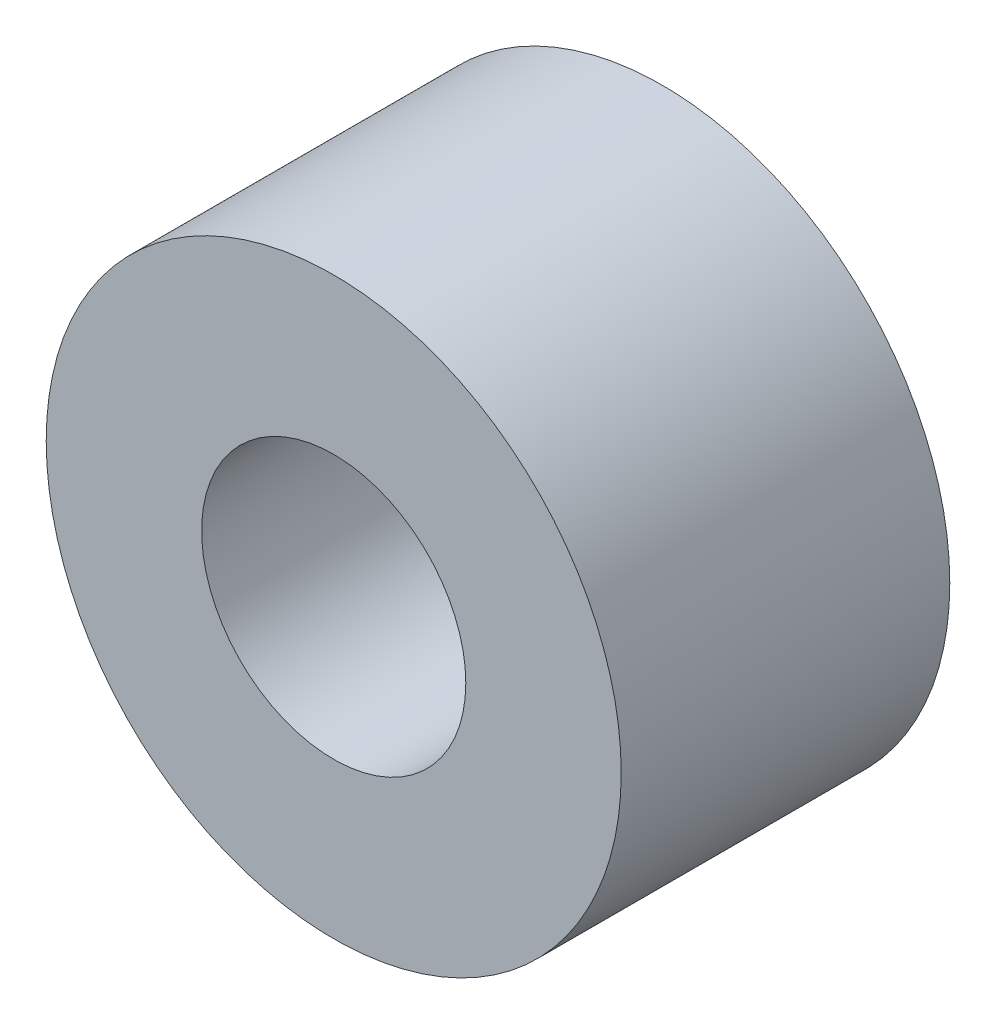
ISO-10303-21;
HEADER;
FILE_DESCRIPTION(('STEP AP214'),'2;1');
FILE_NAME('part.step','',(''),(''),'','','');
FILE_SCHEMA(('AUTOMOTIVE_DESIGN { 1 0 10303 214 1 1 1 1 }'));
ENDSEC;
DATA;
#1=APPLICATION_CONTEXT('core data for automotive mechanical design processes');
#2=APPLICATION_PROTOCOL_DEFINITION('international standard','automotive_design',2000,#1);
#3=PRODUCT_CONTEXT('',#1,'mechanical');
#4=PRODUCT('Part','Part','',(#3));
#5=PRODUCT_RELATED_PRODUCT_CATEGORY('part','',(#4));
#6=PRODUCT_DEFINITION_FORMATION('','',#4);
#7=PRODUCT_DEFINITION_CONTEXT('part definition',#1,'design');
#8=PRODUCT_DEFINITION('design','',#6,#7);
#9=PRODUCT_DEFINITION_SHAPE('','',#8);
#10=(LENGTH_UNIT() NAMED_UNIT(*) SI_UNIT(.MILLI.,.METRE.));
#11=(NAMED_UNIT(*) PLANE_ANGLE_UNIT() SI_UNIT($,.RADIAN.));
#12=(NAMED_UNIT(*) SI_UNIT($,.STERADIAN.) SOLID_ANGLE_UNIT());
#13=UNCERTAINTY_MEASURE_WITH_UNIT(LENGTH_MEASURE(1.E-05),#10,'distance_accuracy_value','');
#14=(GEOMETRIC_REPRESENTATION_CONTEXT(3) GLOBAL_UNCERTAINTY_ASSIGNED_CONTEXT((#13)) GLOBAL_UNIT_ASSIGNED_CONTEXT((#10,
#11,#12)) REPRESENTATION_CONTEXT('',''));
#15=CARTESIAN_POINT('',(0.,0.,0.));
#16=DIRECTION('',(0.,0.,1.));
#17=DIRECTION('',(1.,0.,0.));
#18=AXIS2_PLACEMENT_3D('',#15,#16,#17);
#19=CARTESIAN_POINT('',(0.,0.,6.35));
#20=DIRECTION('',(0.,0.,1.));
#21=DIRECTION('',(1.,0.,0.));
#22=AXIS2_PLACEMENT_3D('',#19,#20,#21);
#23=PLANE('',#22);
#24=CARTESIAN_POINT('',(0.,0.,6.35));
#25=DIRECTION('',(0.,0.,1.));
#26=DIRECTION('',(1.,0.,0.));
#27=AXIS2_PLACEMENT_3D('',#24,#25,#26);
#28=CIRCLE('',#27,5.55625);
#29=CARTESIAN_POINT('',(5.55625,0.,6.35));
#30=VERTEX_POINT('',#29);
#31=EDGE_CURVE('E10',#30,#30,#28,.T.);
#32=ORIENTED_EDGE('',*,*,#31,.T.);
#33=EDGE_LOOP('',(#32));
#34=FACE_BOUND('',#33,.T.);
#35=CARTESIAN_POINT('',(0.,0.,6.35));
#36=DIRECTION('',(0.,0.,1.));
#37=DIRECTION('',(1.,0.,0.));
#38=AXIS2_PLACEMENT_3D('',#35,#36,#37);
#39=CIRCLE('',#38,2.5527);
#40=CARTESIAN_POINT('',(2.5527,0.,6.35));
#41=VERTEX_POINT('',#40);
#42=EDGE_CURVE('E42',#41,#41,#39,.T.);
#43=ORIENTED_EDGE('',*,*,#42,.F.);
#44=EDGE_LOOP('',(#43));
#45=FACE_BOUND('',#44,.T.);
#46=ADVANCED_FACE('F31',(#34,#45),#23,.T.);
#47=CARTESIAN_POINT('',(0.,0.,0.));
#48=DIRECTION('',(0.,0.,1.));
#49=DIRECTION('',(1.,0.,0.));
#50=AXIS2_PLACEMENT_3D('',#47,#48,#49);
#51=PLANE('',#50);
#52=CARTESIAN_POINT('',(0.,0.,0.));
#53=DIRECTION('',(0.,0.,1.));
#54=DIRECTION('',(1.,0.,0.));
#55=AXIS2_PLACEMENT_3D('',#52,#53,#54);
#56=CIRCLE('',#55,5.55625);
#57=CARTESIAN_POINT('',(5.55625,0.,0.));
#58=VERTEX_POINT('',#57);
#59=EDGE_CURVE('E35',#58,#58,#56,.T.);
#60=ORIENTED_EDGE('',*,*,#59,.F.);
#61=EDGE_LOOP('',(#60));
#62=FACE_BOUND('',#61,.T.);
#63=CARTESIAN_POINT('',(0.,0.,0.));
#64=DIRECTION('',(0.,0.,1.));
#65=DIRECTION('',(1.,0.,0.));
#66=AXIS2_PLACEMENT_3D('',#63,#64,#65);
#67=CIRCLE('',#66,2.5527);
#68=CARTESIAN_POINT('',(2.5527,0.,0.));
#69=VERTEX_POINT('',#68);
#70=EDGE_CURVE('E44',#69,#69,#67,.T.);
#71=ORIENTED_EDGE('',*,*,#70,.T.);
#72=EDGE_LOOP('',(#71));
#73=FACE_BOUND('',#72,.T.);
#74=ADVANCED_FACE('F54',(#62,#73),#51,.F.);
#75=CARTESIAN_POINT('',(0.,0.,6.35));
#76=DIRECTION('',(0.,0.,-1.));
#77=DIRECTION('',(-1.,0.,0.));
#78=AXIS2_PLACEMENT_3D('',#75,#76,#77);
#79=CYLINDRICAL_SURFACE('',#78,5.55625);
#80=ORIENTED_EDGE('',*,*,#31,.F.);
#81=EDGE_LOOP('',(#80));
#82=FACE_BOUND('',#81,.T.);
#83=ORIENTED_EDGE('',*,*,#59,.T.);
#84=EDGE_LOOP('',(#83));
#85=FACE_BOUND('',#84,.T.);
#86=ADVANCED_FACE('F33',(#82,#85),#79,.T.);
#87=CARTESIAN_POINT('',(0.,0.,6.35));
#88=DIRECTION('',(0.,0.,-1.));
#89=DIRECTION('',(-1.,0.,0.));
#90=AXIS2_PLACEMENT_3D('',#87,#88,#89);
#91=CYLINDRICAL_SURFACE('',#90,2.5527);
#92=ORIENTED_EDGE('',*,*,#42,.T.);
#93=EDGE_LOOP('',(#92));
#94=FACE_BOUND('',#93,.T.);
#95=ORIENTED_EDGE('',*,*,#70,.F.);
#96=EDGE_LOOP('',(#95));
#97=FACE_BOUND('',#96,.T.);
#98=ADVANCED_FACE('F50',(#94,#97),#91,.F.);
#99=CLOSED_SHELL('',(#46,#74,#86,#98));
#100=MANIFOLD_SOLID_BREP('B2',#99);
#101=ADVANCED_BREP_SHAPE_REPRESENTATION('',(#18,#100),#14);
#102=SHAPE_DEFINITION_REPRESENTATION(#9,#101);
ENDSEC;
END-ISO-10303-21;
